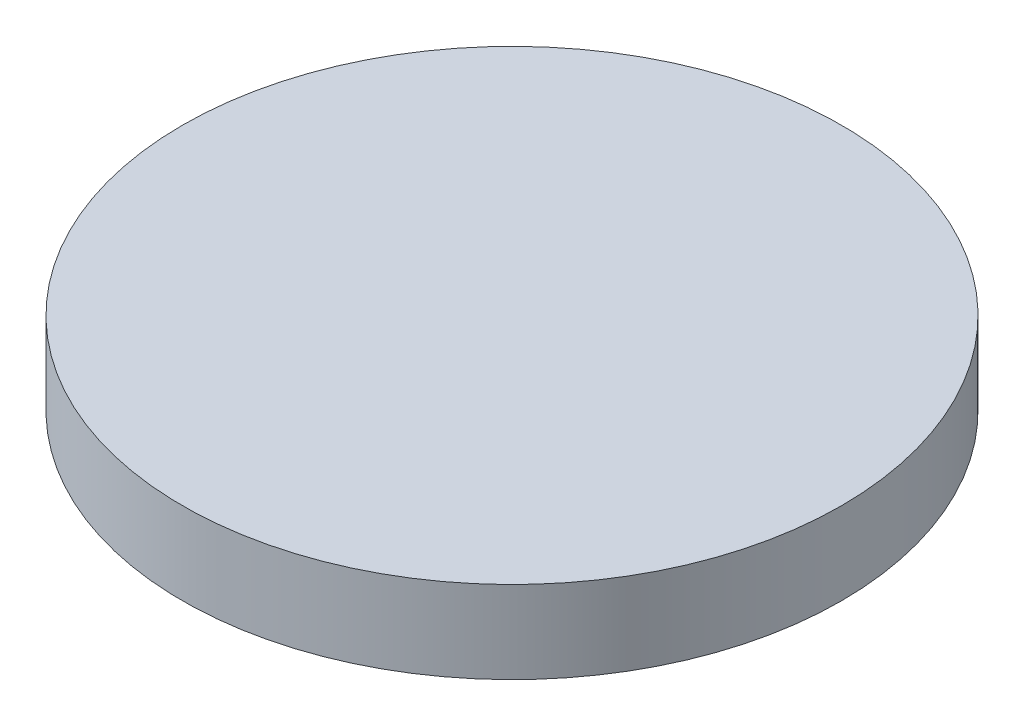
ISO-10303-21;
HEADER;
FILE_DESCRIPTION(('STEP AP214'),'2;1');
FILE_NAME('part.step','',(''),(''),'','','');
FILE_SCHEMA(('AUTOMOTIVE_DESIGN { 1 0 10303 214 1 1 1 1 }'));
ENDSEC;
DATA;
#1=APPLICATION_CONTEXT('core data for automotive mechanical design processes');
#2=APPLICATION_PROTOCOL_DEFINITION('international standard','automotive_design',2000,#1);
#3=PRODUCT_CONTEXT('',#1,'mechanical');
#4=PRODUCT('Part','Part','',(#3));
#5=PRODUCT_RELATED_PRODUCT_CATEGORY('part','',(#4));
#6=PRODUCT_DEFINITION_FORMATION('','',#4);
#7=PRODUCT_DEFINITION_CONTEXT('part definition',#1,'design');
#8=PRODUCT_DEFINITION('design','',#6,#7);
#9=PRODUCT_DEFINITION_SHAPE('','',#8);
#10=(LENGTH_UNIT() NAMED_UNIT(*) SI_UNIT(.MILLI.,.METRE.));
#11=(NAMED_UNIT(*) PLANE_ANGLE_UNIT() SI_UNIT($,.RADIAN.));
#12=(NAMED_UNIT(*) SI_UNIT($,.STERADIAN.) SOLID_ANGLE_UNIT());
#13=UNCERTAINTY_MEASURE_WITH_UNIT(LENGTH_MEASURE(1.E-05),#10,'distance_accuracy_value','');
#14=(GEOMETRIC_REPRESENTATION_CONTEXT(3) GLOBAL_UNCERTAINTY_ASSIGNED_CONTEXT((#13)) GLOBAL_UNIT_ASSIGNED_CONTEXT((#10,
#11,#12)) REPRESENTATION_CONTEXT('',''));
#15=CARTESIAN_POINT('',(0.,0.,0.));
#16=DIRECTION('',(0.,0.,1.));
#17=DIRECTION('',(1.,0.,0.));
#18=AXIS2_PLACEMENT_3D('',#15,#16,#17);
#19=CARTESIAN_POINT('',(0.,3.175,0.));
#20=DIRECTION('',(0.,1.,0.));
#21=DIRECTION('',(-1.,0.,0.));
#22=AXIS2_PLACEMENT_3D('',#19,#20,#21);
#23=PLANE('',#22);
#24=CARTESIAN_POINT('',(0.,3.17500000000001,0.));
#25=DIRECTION('',(0.,-1.,0.));
#26=DIRECTION('',(1.,0.,0.));
#27=AXIS2_PLACEMENT_3D('',#24,#25,#26);
#28=CIRCLE('',#27,12.7);
#29=CARTESIAN_POINT('',(12.7,3.175,0.));
#30=VERTEX_POINT('',#29);
#31=EDGE_CURVE('E10',#30,#30,#28,.T.);
#32=ORIENTED_EDGE('',*,*,#31,.F.);
#33=EDGE_LOOP('',(#32));
#34=FACE_BOUND('',#33,.T.);
#35=ADVANCED_FACE('F33',(#34),#23,.T.);
#36=CARTESIAN_POINT('',(0.,0.,0.));
#37=DIRECTION('',(0.,-1.,0.));
#38=DIRECTION('',(1.,0.,0.));
#39=AXIS2_PLACEMENT_3D('',#36,#37,#38);
#40=CYLINDRICAL_SURFACE('',#39,12.7);
#41=ORIENTED_EDGE('',*,*,#31,.T.);
#42=EDGE_LOOP('',(#41));
#43=FACE_BOUND('',#42,.T.);
#44=CARTESIAN_POINT('',(0.,0.,0.));
#45=DIRECTION('',(0.,-1.,0.));
#46=DIRECTION('',(1.,0.,0.));
#47=AXIS2_PLACEMENT_3D('',#44,#45,#46);
#48=CIRCLE('',#47,12.7);
#49=CARTESIAN_POINT('',(12.7,0.,0.));
#50=VERTEX_POINT('',#49);
#51=EDGE_CURVE('E39',#50,#50,#48,.T.);
#52=ORIENTED_EDGE('',*,*,#51,.F.);
#53=EDGE_LOOP('',(#52));
#54=FACE_BOUND('',#53,.T.);
#55=ADVANCED_FACE('F47',(#43,#54),#40,.T.);
#56=CARTESIAN_POINT('',(0.,0.,0.));
#57=DIRECTION('',(0.,-1.,0.));
#58=DIRECTION('',(1.,0.,0.));
#59=AXIS2_PLACEMENT_3D('',#56,#57,#58);
#60=PLANE('',#59);
#61=ORIENTED_EDGE('',*,*,#51,.T.);
#62=EDGE_LOOP('',(#61));
#63=FACE_BOUND('',#62,.T.);
#64=ADVANCED_FACE('F45',(#63),#60,.T.);
#65=CLOSED_SHELL('',(#35,#55,#64));
#66=MANIFOLD_SOLID_BREP('B2',#65);
#67=ADVANCED_BREP_SHAPE_REPRESENTATION('',(#18,#66),#14);
#68=SHAPE_DEFINITION_REPRESENTATION(#9,#67);
ENDSEC;
END-ISO-10303-21;
